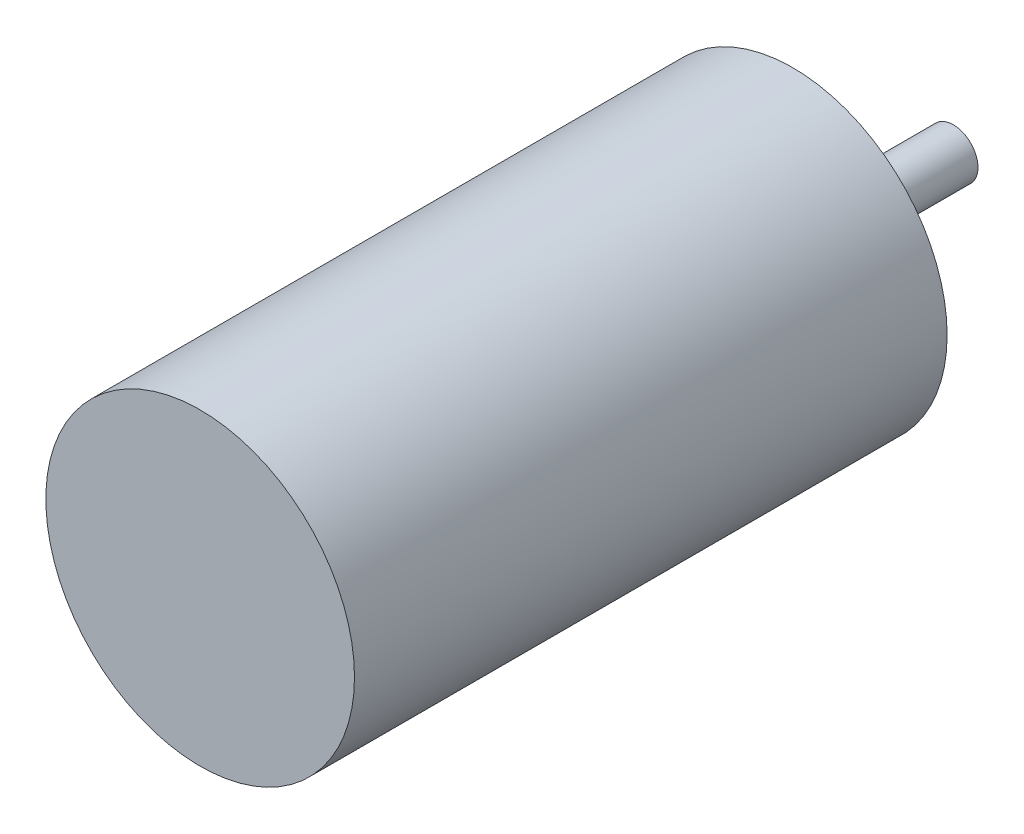
ISO-10303-21;
HEADER;
FILE_DESCRIPTION(('STEP AP214'),'2;1');
FILE_NAME('part.step','',(''),(''),'','','');
FILE_SCHEMA(('AUTOMOTIVE_DESIGN { 1 0 10303 214 1 1 1 1 }'));
ENDSEC;
DATA;
#1=APPLICATION_CONTEXT('core data for automotive mechanical design processes');
#2=APPLICATION_PROTOCOL_DEFINITION('international standard','automotive_design',2000,#1);
#3=PRODUCT_CONTEXT('',#1,'mechanical');
#4=PRODUCT('Part','Part','',(#3));
#5=PRODUCT_RELATED_PRODUCT_CATEGORY('part','',(#4));
#6=PRODUCT_DEFINITION_FORMATION('','',#4);
#7=PRODUCT_DEFINITION_CONTEXT('part definition',#1,'design');
#8=PRODUCT_DEFINITION('design','',#6,#7);
#9=PRODUCT_DEFINITION_SHAPE('','',#8);
#10=(LENGTH_UNIT() NAMED_UNIT(*) SI_UNIT(.MILLI.,.METRE.));
#11=(NAMED_UNIT(*) PLANE_ANGLE_UNIT() SI_UNIT($,.RADIAN.));
#12=(NAMED_UNIT(*) SI_UNIT($,.STERADIAN.) SOLID_ANGLE_UNIT());
#13=UNCERTAINTY_MEASURE_WITH_UNIT(LENGTH_MEASURE(1.E-05),#10,'distance_accuracy_value','');
#14=(GEOMETRIC_REPRESENTATION_CONTEXT(3) GLOBAL_UNCERTAINTY_ASSIGNED_CONTEXT((#13)) GLOBAL_UNIT_ASSIGNED_CONTEXT((#10,
#11,#12)) REPRESENTATION_CONTEXT('',''));
#15=CARTESIAN_POINT('',(0.,0.,0.));
#16=DIRECTION('',(0.,0.,1.));
#17=DIRECTION('',(1.,0.,0.));
#18=AXIS2_PLACEMENT_3D('',#15,#16,#17);
#19=CARTESIAN_POINT('',(0.,0.,0.));
#20=DIRECTION('',(0.,0.,-1.));
#21=DIRECTION('',(-1.,0.,0.));
#22=AXIS2_PLACEMENT_3D('',#19,#20,#21);
#23=PLANE('',#22);
#24=CARTESIAN_POINT('',(0.,0.,0.));
#25=DIRECTION('',(0.,0.,1.));
#26=DIRECTION('',(1.,0.,0.));
#27=AXIS2_PLACEMENT_3D('',#24,#25,#26);
#28=CIRCLE('',#27,2.);
#29=CARTESIAN_POINT('',(2.,0.,0.));
#30=VERTEX_POINT('',#29);
#31=EDGE_CURVE('E11',#30,#30,#28,.T.);
#32=ORIENTED_EDGE('',*,*,#31,.F.);
#33=EDGE_LOOP('',(#32));
#34=FACE_BOUND('',#33,.T.);
#35=ADVANCED_FACE('F38',(#34),#23,.T.);
#36=CARTESIAN_POINT('',(0.,0.,61.));
#37=DIRECTION('',(0.,0.,1.));
#38=DIRECTION('',(1.,0.,0.));
#39=AXIS2_PLACEMENT_3D('',#36,#37,#38);
#40=CYLINDRICAL_SURFACE('',#39,2.);
#41=ORIENTED_EDGE('',*,*,#31,.T.);
#42=EDGE_LOOP('',(#41));
#43=FACE_BOUND('',#42,.T.);
#44=CARTESIAN_POINT('',(0.,0.,10.));
#45=DIRECTION('',(0.,0.,1.));
#46=DIRECTION('',(1.,0.,0.));
#47=AXIS2_PLACEMENT_3D('',#44,#45,#46);
#48=CIRCLE('',#47,2.);
#49=CARTESIAN_POINT('',(2.,0.,10.));
#50=VERTEX_POINT('',#49);
#51=EDGE_CURVE('E46',#50,#50,#48,.T.);
#52=ORIENTED_EDGE('',*,*,#51,.F.);
#53=EDGE_LOOP('',(#52));
#54=FACE_BOUND('',#53,.T.);
#55=ADVANCED_FACE('F99',(#43,#54),#40,.T.);
#56=CARTESIAN_POINT('',(0.,-2.,10.));
#57=DIRECTION('',(0.,0.,-1.));
#58=DIRECTION('',(-1.,0.,0.));
#59=AXIS2_PLACEMENT_3D('',#56,#57,#58);
#60=PLANE('',#59);
#61=ORIENTED_EDGE('',*,*,#51,.T.);
#62=EDGE_LOOP('',(#61));
#63=FACE_BOUND('',#62,.T.);
#64=CARTESIAN_POINT('',(0.,0.,10.));
#65=DIRECTION('',(0.,0.,1.));
#66=DIRECTION('',(1.,0.,0.));
#67=AXIS2_PLACEMENT_3D('',#64,#65,#66);
#68=CIRCLE('',#67,3.5);
#69=CARTESIAN_POINT('',(3.5,0.,10.));
#70=VERTEX_POINT('',#69);
#71=EDGE_CURVE('E89',#70,#70,#68,.T.);
#72=ORIENTED_EDGE('',*,*,#71,.F.);
#73=EDGE_LOOP('',(#72));
#74=FACE_BOUND('',#73,.T.);
#75=ADVANCED_FACE('F96',(#63,#74),#60,.T.);
#76=CARTESIAN_POINT('',(0.,0.,61.));
#77=DIRECTION('',(0.,0.,1.));
#78=DIRECTION('',(1.,0.,0.));
#79=AXIS2_PLACEMENT_3D('',#76,#77,#78);
#80=CYLINDRICAL_SURFACE('',#79,3.5);
#81=ORIENTED_EDGE('',*,*,#71,.T.);
#82=EDGE_LOOP('',(#81));
#83=FACE_BOUND('',#82,.T.);
#84=CARTESIAN_POINT('',(0.,0.,13.));
#85=DIRECTION('',(0.,0.,1.));
#86=DIRECTION('',(1.,0.,0.));
#87=AXIS2_PLACEMENT_3D('',#84,#85,#86);
#88=CIRCLE('',#87,3.5);
#89=CARTESIAN_POINT('',(3.5,0.,13.));
#90=VERTEX_POINT('',#89);
#91=EDGE_CURVE('E85',#90,#90,#88,.T.);
#92=ORIENTED_EDGE('',*,*,#91,.F.);
#93=EDGE_LOOP('',(#92));
#94=FACE_BOUND('',#93,.T.);
#95=ADVANCED_FACE('F106',(#83,#94),#80,.T.);
#96=CARTESIAN_POINT('',(0.,-3.5,13.));
#97=DIRECTION('',(0.,0.,-1.));
#98=DIRECTION('',(-1.,0.,0.));
#99=AXIS2_PLACEMENT_3D('',#96,#97,#98);
#100=PLANE('',#99);
#101=CARTESIAN_POINT('',(8.5,0.,13.));
#102=DIRECTION('',(0.,0.,-1.));
#103=DIRECTION('',(-1.,0.,0.));
#104=AXIS2_PLACEMENT_3D('',#101,#102,#103);
#105=CIRCLE('',#104,1.24999999999999);
#106=CARTESIAN_POINT('',(7.25000000000001,0.,13.));
#107=VERTEX_POINT('',#106);
#108=EDGE_CURVE('E64',#107,#107,#105,.T.);
#109=ORIENTED_EDGE('',*,*,#108,.F.);
#110=EDGE_LOOP('',(#109));
#111=FACE_BOUND('',#110,.T.);
#112=CARTESIAN_POINT('',(-8.5,0.,13.));
#113=DIRECTION('',(0.,0.,-1.));
#114=DIRECTION('',(-1.,0.,0.));
#115=AXIS2_PLACEMENT_3D('',#112,#113,#114);
#116=CIRCLE('',#115,1.24999999999999);
#117=CARTESIAN_POINT('',(-9.74999999999999,0.,13.));
#118=VERTEX_POINT('',#117);
#119=EDGE_CURVE('E63',#118,#118,#116,.T.);
#120=ORIENTED_EDGE('',*,*,#119,.F.);
#121=EDGE_LOOP('',(#120));
#122=FACE_BOUND('',#121,.T.);
#123=ORIENTED_EDGE('',*,*,#91,.T.);
#124=EDGE_LOOP('',(#123));
#125=FACE_BOUND('',#124,.T.);
#126=CARTESIAN_POINT('',(0.,0.,13.));
#127=DIRECTION('',(0.,0.,1.));
#128=DIRECTION('',(1.,0.,0.));
#129=AXIS2_PLACEMENT_3D('',#126,#127,#128);
#130=CIRCLE('',#129,12.5);
#131=CARTESIAN_POINT('',(12.5,0.,13.));
#132=VERTEX_POINT('',#131);
#133=EDGE_CURVE('E81',#132,#132,#130,.T.);
#134=ORIENTED_EDGE('',*,*,#133,.F.);
#135=EDGE_LOOP('',(#134));
#136=FACE_BOUND('',#135,.T.);
#137=ADVANCED_FACE('F112',(#111,#122,#125,#136),#100,.T.);
#138=CARTESIAN_POINT('',(0.,0.,61.));
#139=DIRECTION('',(0.,0.,1.));
#140=DIRECTION('',(1.,0.,0.));
#141=AXIS2_PLACEMENT_3D('',#138,#139,#140);
#142=CYLINDRICAL_SURFACE('',#141,12.5);
#143=ORIENTED_EDGE('',*,*,#133,.T.);
#144=EDGE_LOOP('',(#143));
#145=FACE_BOUND('',#144,.T.);
#146=CARTESIAN_POINT('',(0.,0.,61.));
#147=DIRECTION('',(0.,0.,1.));
#148=DIRECTION('',(1.,0.,0.));
#149=AXIS2_PLACEMENT_3D('',#146,#147,#148);
#150=CIRCLE('',#149,12.5);
#151=CARTESIAN_POINT('',(12.5,0.,61.));
#152=VERTEX_POINT('',#151);
#153=EDGE_CURVE('E77',#152,#152,#150,.T.);
#154=ORIENTED_EDGE('',*,*,#153,.F.);
#155=EDGE_LOOP('',(#154));
#156=FACE_BOUND('',#155,.T.);
#157=ADVANCED_FACE('F116',(#145,#156),#142,.T.);
#158=CARTESIAN_POINT('',(0.,-12.5,61.));
#159=DIRECTION('',(0.,0.,1.));
#160=DIRECTION('',(1.,0.,0.));
#161=AXIS2_PLACEMENT_3D('',#158,#159,#160);
#162=PLANE('',#161);
#163=ORIENTED_EDGE('',*,*,#153,.T.);
#164=EDGE_LOOP('',(#163));
#165=FACE_BOUND('',#164,.T.);
#166=ADVANCED_FACE('F120',(#165),#162,.T.);
#167=CARTESIAN_POINT('',(-8.5,0.,18.));
#168=DIRECTION('',(0.,0.,-1.));
#169=DIRECTION('',(-1.,0.,0.));
#170=AXIS2_PLACEMENT_3D('',#167,#168,#169);
#171=CONICAL_SURFACE('',#170,1.25,1.02974425867665);
#172=CARTESIAN_POINT('',(-8.5,0.,18.7510757737845));
#173=VERTEX_POINT('',#172);
#174=VERTEX_LOOP('',#173);
#175=FACE_BOUND('',#174,.T.);
#176=CARTESIAN_POINT('',(-8.5,0.,18.));
#177=DIRECTION('',(0.,0.,-1.));
#178=DIRECTION('',(-1.,0.,0.));
#179=AXIS2_PLACEMENT_3D('',#176,#177,#178);
#180=CIRCLE('',#179,1.25);
#181=CARTESIAN_POINT('',(-9.75,0.,18.));
#182=VERTEX_POINT('',#181);
#183=EDGE_CURVE('E69',#182,#182,#180,.T.);
#184=ORIENTED_EDGE('',*,*,#183,.T.);
#185=EDGE_LOOP('',(#184));
#186=FACE_BOUND('',#185,.T.);
#187=ADVANCED_FACE('F124',(#175,#186),#171,.F.);
#188=CARTESIAN_POINT('',(-8.5,0.,13.));
#189=DIRECTION('',(0.,0.,-1.));
#190=DIRECTION('',(-1.,0.,0.));
#191=AXIS2_PLACEMENT_3D('',#188,#189,#190);
#192=CYLINDRICAL_SURFACE('',#191,1.24999999999999);
#193=ORIENTED_EDGE('',*,*,#183,.F.);
#194=EDGE_LOOP('',(#193));
#195=FACE_BOUND('',#194,.T.);
#196=ORIENTED_EDGE('',*,*,#119,.T.);
#197=EDGE_LOOP('',(#196));
#198=FACE_BOUND('',#197,.T.);
#199=ADVANCED_FACE('F56',(#195,#198),#192,.F.);
#200=CARTESIAN_POINT('',(8.5,0.,18.));
#201=DIRECTION('',(0.,0.,-1.));
#202=DIRECTION('',(-1.,0.,0.));
#203=AXIS2_PLACEMENT_3D('',#200,#201,#202);
#204=CONICAL_SURFACE('',#203,1.25,1.02974425867665);
#205=CARTESIAN_POINT('',(8.5,0.,18.7510757737845));
#206=VERTEX_POINT('',#205);
#207=VERTEX_LOOP('',#206);
#208=FACE_BOUND('',#207,.T.);
#209=CARTESIAN_POINT('',(8.5,0.,18.));
#210=DIRECTION('',(0.,0.,-1.));
#211=DIRECTION('',(-1.,0.,0.));
#212=AXIS2_PLACEMENT_3D('',#209,#210,#211);
#213=CIRCLE('',#212,1.25);
#214=CARTESIAN_POINT('',(7.25,0.,18.));
#215=VERTEX_POINT('',#214);
#216=EDGE_CURVE('E60',#215,#215,#213,.T.);
#217=ORIENTED_EDGE('',*,*,#216,.T.);
#218=EDGE_LOOP('',(#217));
#219=FACE_BOUND('',#218,.T.);
#220=ADVANCED_FACE('F52',(#208,#219),#204,.F.);
#221=CARTESIAN_POINT('',(8.5,0.,13.));
#222=DIRECTION('',(0.,0.,-1.));
#223=DIRECTION('',(-1.,0.,0.));
#224=AXIS2_PLACEMENT_3D('',#221,#222,#223);
#225=CYLINDRICAL_SURFACE('',#224,1.24999999999999);
#226=ORIENTED_EDGE('',*,*,#216,.F.);
#227=EDGE_LOOP('',(#226));
#228=FACE_BOUND('',#227,.T.);
#229=ORIENTED_EDGE('',*,*,#108,.T.);
#230=EDGE_LOOP('',(#229));
#231=FACE_BOUND('',#230,.T.);
#232=ADVANCED_FACE('F55',(#228,#231),#225,.F.);
#233=CLOSED_SHELL('',(#35,#55,#75,#95,#137,#157,#166,#187,#199,#220,#232));
#234=MANIFOLD_SOLID_BREP('B2',#233);
#235=ADVANCED_BREP_SHAPE_REPRESENTATION('',(#18,#234),#14);
#236=SHAPE_DEFINITION_REPRESENTATION(#9,#235);
ENDSEC;
END-ISO-10303-21;
